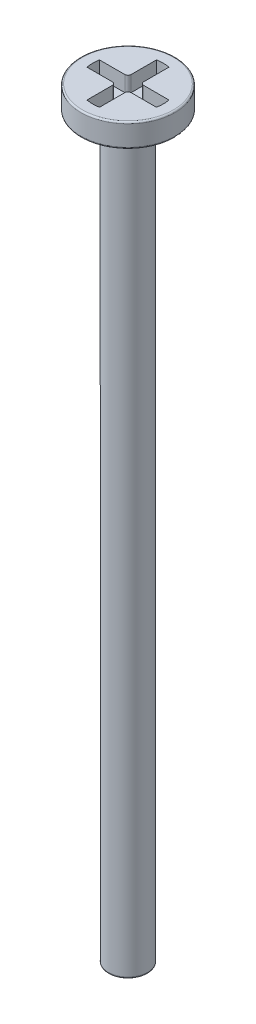
ISO-10303-21;
HEADER;
FILE_DESCRIPTION(('STEP AP214'),'2;1');
FILE_NAME('part.step','',(''),(''),'','','');
FILE_SCHEMA(('AUTOMOTIVE_DESIGN { 1 0 10303 214 1 1 1 1 }'));
ENDSEC;
DATA;
#1=APPLICATION_CONTEXT('core data for automotive mechanical design processes');
#2=APPLICATION_PROTOCOL_DEFINITION('international standard','automotive_design',2000,#1);
#3=PRODUCT_CONTEXT('',#1,'mechanical');
#4=PRODUCT('Part','Part','',(#3));
#5=PRODUCT_RELATED_PRODUCT_CATEGORY('part','',(#4));
#6=PRODUCT_DEFINITION_FORMATION('','',#4);
#7=PRODUCT_DEFINITION_CONTEXT('part definition',#1,'design');
#8=PRODUCT_DEFINITION('design','',#6,#7);
#9=PRODUCT_DEFINITION_SHAPE('','',#8);
#10=(LENGTH_UNIT() NAMED_UNIT(*) SI_UNIT(.MILLI.,.METRE.));
#11=(NAMED_UNIT(*) PLANE_ANGLE_UNIT() SI_UNIT($,.RADIAN.));
#12=(NAMED_UNIT(*) SI_UNIT($,.STERADIAN.) SOLID_ANGLE_UNIT());
#13=UNCERTAINTY_MEASURE_WITH_UNIT(LENGTH_MEASURE(1.E-05),#10,'distance_accuracy_value','');
#14=(GEOMETRIC_REPRESENTATION_CONTEXT(3) GLOBAL_UNCERTAINTY_ASSIGNED_CONTEXT((#13)) GLOBAL_UNIT_ASSIGNED_CONTEXT((#10,
#11,#12)) REPRESENTATION_CONTEXT('',''));
#15=CARTESIAN_POINT('',(0.,0.,0.));
#16=DIRECTION('',(0.,0.,1.));
#17=DIRECTION('',(1.,0.,0.));
#18=AXIS2_PLACEMENT_3D('',#15,#16,#17);
#19=CARTESIAN_POINT('',(0.,0.,0.));
#20=DIRECTION('',(0.,1.,0.));
#21=DIRECTION('',(0.,0.,1.));
#22=AXIS2_PLACEMENT_3D('',#19,#20,#21);
#23=PLANE('',#22);
#24=CARTESIAN_POINT('',(0.,0.,0.));
#25=DIRECTION('',(0.,1.,0.));
#26=DIRECTION('',(0.,0.,1.));
#27=AXIS2_PLACEMENT_3D('',#24,#25,#26);
#28=CIRCLE('',#27,2.25);
#29=CARTESIAN_POINT('',(0.400000000000136,0.,-2.21415898254844));
#30=VERTEX_POINT('',#29);
#31=CARTESIAN_POINT('',(-0.3999999999999,0.,-2.21415898254845));
#32=VERTEX_POINT('',#31);
#33=EDGE_CURVE('E47',#30,#32,#28,.T.);
#34=ORIENTED_EDGE('',*,*,#33,.F.);
#35=DIRECTION('',(0.,0.,-1.));
#36=VECTOR('',#35,1.);
#37=CARTESIAN_POINT('',(0.400000000000136,0.,-2.21415898254844));
#38=LINE('',#37,#36);
#39=CARTESIAN_POINT('',(0.399999999999956,0.,-0.59999999999992));
#40=VERTEX_POINT('',#39);
#41=EDGE_CURVE('E220',#40,#30,#38,.T.);
#42=ORIENTED_EDGE('',*,*,#41,.F.);
#43=CARTESIAN_POINT('',(0.599999999999934,0.,-0.600000000000003));
#44=DIRECTION('',(0.,-1.,0.));
#45=DIRECTION('',(0.,0.,-1.));
#46=AXIS2_PLACEMENT_3D('',#43,#44,#45);
#47=CIRCLE('',#46,0.2);
#48=CARTESIAN_POINT('',(0.600000000000031,0.,-0.39999999999997));
#49=VERTEX_POINT('',#48);
#50=EDGE_CURVE('E218',#49,#40,#47,.T.);
#51=ORIENTED_EDGE('',*,*,#50,.F.);
#52=DIRECTION('',(-1.,0.,0.));
#53=VECTOR('',#52,1.);
#54=CARTESIAN_POINT('',(0.600000000000031,0.,-0.39999999999997));
#55=LINE('',#54,#53);
#56=CARTESIAN_POINT('',(2.21415898254844,0.,-0.400000000000025));
#57=VERTEX_POINT('',#56);
#58=EDGE_CURVE('E155',#57,#49,#55,.T.);
#59=ORIENTED_EDGE('',*,*,#58,.F.);
#60=CARTESIAN_POINT('',(0.,0.,0.));
#61=DIRECTION('',(0.,1.,0.));
#62=DIRECTION('',(0.,0.,1.));
#63=AXIS2_PLACEMENT_3D('',#60,#61,#62);
#64=CIRCLE('',#63,2.25);
#65=CARTESIAN_POINT('',(2.21415898254837,0.,0.39999999999997));
#66=VERTEX_POINT('',#65);
#67=EDGE_CURVE('E214',#66,#57,#64,.T.);
#68=ORIENTED_EDGE('',*,*,#67,.F.);
#69=DIRECTION('',(1.,0.,0.));
#70=VECTOR('',#69,1.);
#71=CARTESIAN_POINT('',(0.599999999999962,0.,0.399999999999998));
#72=LINE('',#71,#70);
#73=CARTESIAN_POINT('',(0.599999999999962,0.,0.399999999999998));
#74=VERTEX_POINT('',#73);
#75=EDGE_CURVE('E211',#74,#66,#72,.T.);
#76=ORIENTED_EDGE('',*,*,#75,.F.);
#77=CARTESIAN_POINT('',(0.599999999999878,0.,0.600000000000073));
#78=DIRECTION('',(0.,-1.,0.));
#79=DIRECTION('',(0.,0.,-1.));
#80=AXIS2_PLACEMENT_3D('',#77,#78,#79);
#81=CIRCLE('',#80,0.2);
#82=CARTESIAN_POINT('',(0.400000000000122,0.,0.600000000000031));
#83=VERTEX_POINT('',#82);
#84=EDGE_CURVE('E208',#83,#74,#81,.T.);
#85=ORIENTED_EDGE('',*,*,#84,.F.);
#86=DIRECTION('',(0.,0.,-1.));
#87=VECTOR('',#86,1.);
#88=CARTESIAN_POINT('',(0.400000000000122,0.,0.600000000000031));
#89=LINE('',#88,#87);
#90=CARTESIAN_POINT('',(0.399999999999956,0.,2.21415898254848));
#91=VERTEX_POINT('',#90);
#92=EDGE_CURVE('E205',#91,#83,#89,.T.);
#93=ORIENTED_EDGE('',*,*,#92,.F.);
#94=CARTESIAN_POINT('',(0.,0.,0.));
#95=DIRECTION('',(0.,1.,0.));
#96=DIRECTION('',(0.,0.,1.));
#97=AXIS2_PLACEMENT_3D('',#94,#95,#96);
#98=CIRCLE('',#97,2.25);
#99=CARTESIAN_POINT('',(-0.400000000000011,0.,2.21415898254848));
#100=VERTEX_POINT('',#99);
#101=EDGE_CURVE('E202',#100,#91,#98,.T.);
#102=ORIENTED_EDGE('',*,*,#101,.F.);
#103=DIRECTION('',(0.,0.,1.));
#104=VECTOR('',#103,1.);
#105=CARTESIAN_POINT('',(-0.399999999999887,0.,0.600000000000087));
#106=LINE('',#105,#104);
#107=CARTESIAN_POINT('',(-0.399999999999887,0.,0.600000000000087));
#108=VERTEX_POINT('',#107);
#109=EDGE_CURVE('E199',#108,#100,#106,.T.);
#110=ORIENTED_EDGE('',*,*,#109,.F.);
#111=CARTESIAN_POINT('',(-0.59999999999992,0.,0.600000000000031));
#112=DIRECTION('',(0.,-1.,0.));
#113=DIRECTION('',(0.,0.,-1.));
#114=AXIS2_PLACEMENT_3D('',#111,#112,#113);
#115=CIRCLE('',#114,0.2);
#116=CARTESIAN_POINT('',(-0.6000000000001,0.,0.399999999999984));
#117=VERTEX_POINT('',#116);
#118=EDGE_CURVE('E196',#117,#108,#115,.T.);
#119=ORIENTED_EDGE('',*,*,#118,.F.);
#120=DIRECTION('',(1.,0.,0.));
#121=VECTOR('',#120,1.);
#122=CARTESIAN_POINT('',(-2.21415898254856,0.,0.400000000000039));
#123=LINE('',#122,#121);
#124=CARTESIAN_POINT('',(-2.21415898254856,0.,0.400000000000039));
#125=VERTEX_POINT('',#124);
#126=EDGE_CURVE('E193',#125,#117,#123,.T.);
#127=ORIENTED_EDGE('',*,*,#126,.F.);
#128=CARTESIAN_POINT('',(0.,0.,0.));
#129=DIRECTION('',(0.,1.,0.));
#130=DIRECTION('',(0.,0.,1.));
#131=AXIS2_PLACEMENT_3D('',#128,#129,#130);
#132=CIRCLE('',#131,2.25);
#133=CARTESIAN_POINT('',(-2.21415898254836,0.,-0.399999999999956));
#134=VERTEX_POINT('',#133);
#135=EDGE_CURVE('E190',#134,#125,#132,.T.);
#136=ORIENTED_EDGE('',*,*,#135,.F.);
#137=DIRECTION('',(-1.,0.,0.));
#138=VECTOR('',#137,1.);
#139=CARTESIAN_POINT('',(-2.21415898254836,0.,-0.399999999999956));
#140=LINE('',#139,#138);
#141=CARTESIAN_POINT('',(-0.599999999999989,0.,-0.400000000000011));
#142=VERTEX_POINT('',#141);
#143=EDGE_CURVE('E187',#142,#134,#140,.T.);
#144=ORIENTED_EDGE('',*,*,#143,.F.);
#145=CARTESIAN_POINT('',(-0.599999999999976,0.,-0.599999999999976));
#146=DIRECTION('',(0.,-1.,0.));
#147=DIRECTION('',(0.,0.,-1.));
#148=AXIS2_PLACEMENT_3D('',#145,#146,#147);
#149=CIRCLE('',#148,0.2);
#150=CARTESIAN_POINT('',(-0.400000000000095,0.,-0.599999999999892));
#151=VERTEX_POINT('',#150);
#152=EDGE_CURVE('E184',#151,#142,#149,.T.);
#153=ORIENTED_EDGE('',*,*,#152,.F.);
#154=DIRECTION('',(0.,0.,1.));
#155=VECTOR('',#154,1.);
#156=CARTESIAN_POINT('',(-0.3999999999999,0.,-2.21415898254845));
#157=LINE('',#156,#155);
#158=EDGE_CURVE('E181',#32,#151,#157,.T.);
#159=ORIENTED_EDGE('',*,*,#158,.F.);
#160=EDGE_LOOP('',(#34,#42,#51,#59,#68,#76,#85,#93,#102,#110,#119,#127,#136,#144,#153,#159));
#161=FACE_BOUND('',#160,.T.);
#162=CARTESIAN_POINT('',(0.,0.,0.));
#163=DIRECTION('',(0.,1.,0.));
#164=DIRECTION('',(0.,0.,1.));
#165=AXIS2_PLACEMENT_3D('',#162,#163,#164);
#166=CIRCLE('',#165,2.9);
#167=CARTESIAN_POINT('',(0.,0.,2.9));
#168=VERTEX_POINT('',#167);
#169=EDGE_CURVE('E258',#168,#168,#166,.T.);
#170=ORIENTED_EDGE('',*,*,#169,.T.);
#171=EDGE_LOOP('',(#170));
#172=FACE_BOUND('',#171,.T.);
#173=ADVANCED_FACE('F32',(#161,#172),#23,.T.);
#174=CARTESIAN_POINT('',(0.,14.9128552678076,0.));
#175=DIRECTION('',(0.,1.,0.));
#176=DIRECTION('',(0.,0.,1.));
#177=AXIS2_PLACEMENT_3D('',#174,#175,#176);
#178=CYLINDRICAL_SURFACE('',#177,3.);
#179=CARTESIAN_POINT('',(0.,-0.100000000000003,0.));
#180=DIRECTION('',(0.,1.,0.));
#181=DIRECTION('',(0.,0.,1.));
#182=AXIS2_PLACEMENT_3D('',#179,#180,#181);
#183=CIRCLE('',#182,3.);
#184=CARTESIAN_POINT('',(0.,-0.100000000000003,3.));
#185=VERTEX_POINT('',#184);
#186=EDGE_CURVE('E40',#185,#185,#183,.F.);
#187=ORIENTED_EDGE('',*,*,#186,.T.);
#188=EDGE_LOOP('',(#187));
#189=FACE_BOUND('',#188,.T.);
#190=CARTESIAN_POINT('',(0.,-1.4,0.));
#191=DIRECTION('',(0.,-1.,0.));
#192=DIRECTION('',(0.,0.,-1.));
#193=AXIS2_PLACEMENT_3D('',#190,#191,#192);
#194=CIRCLE('',#193,3.);
#195=CARTESIAN_POINT('',(0.,-1.4,-3.));
#196=VERTEX_POINT('',#195);
#197=EDGE_CURVE('E261',#196,#196,#194,.F.);
#198=ORIENTED_EDGE('',*,*,#197,.T.);
#199=EDGE_LOOP('',(#198));
#200=FACE_BOUND('',#199,.T.);
#201=ADVANCED_FACE('F266',(#189,#200),#178,.T.);
#202=CARTESIAN_POINT('',(-3.00000000000009,-1.50000000000003,0.));
#203=DIRECTION('',(0.,-1.,0.));
#204=DIRECTION('',(0.,0.,-1.));
#205=AXIS2_PLACEMENT_3D('',#202,#203,#204);
#206=PLANE('',#205);
#207=CARTESIAN_POINT('',(0.,-1.5,0.));
#208=DIRECTION('',(0.,-1.,0.));
#209=DIRECTION('',(0.,0.,-1.));
#210=AXIS2_PLACEMENT_3D('',#207,#208,#209);
#211=CIRCLE('',#210,2.9);
#212=CARTESIAN_POINT('',(0.,-1.5,-2.9));
#213=VERTEX_POINT('',#212);
#214=EDGE_CURVE('E11',#213,#213,#211,.T.);
#215=ORIENTED_EDGE('',*,*,#214,.T.);
#216=EDGE_LOOP('',(#215));
#217=FACE_BOUND('',#216,.T.);
#218=CARTESIAN_POINT('',(0.,-1.5,0.));
#219=DIRECTION('',(0.,1.,0.));
#220=DIRECTION('',(0.,0.,1.));
#221=AXIS2_PLACEMENT_3D('',#218,#219,#220);
#222=CIRCLE('',#221,1.25);
#223=CARTESIAN_POINT('',(0.,-1.5,1.25));
#224=VERTEX_POINT('',#223);
#225=EDGE_CURVE('E224',#224,#224,#222,.T.);
#226=ORIENTED_EDGE('',*,*,#225,.T.);
#227=EDGE_LOOP('',(#226));
#228=FACE_BOUND('',#227,.T.);
#229=ADVANCED_FACE('F281',(#217,#228),#206,.T.);
#230=CARTESIAN_POINT('',(0.,14.9128552678076,0.));
#231=DIRECTION('',(0.,1.,0.));
#232=DIRECTION('',(0.,0.,1.));
#233=AXIS2_PLACEMENT_3D('',#230,#231,#232);
#234=CYLINDRICAL_SURFACE('',#233,1.25);
#235=CARTESIAN_POINT('',(0.,-48.4000000000002,-1.2490009027033E-13));
#236=DIRECTION('',(0.,-1.,0.));
#237=DIRECTION('',(0.,0.,-1.));
#238=AXIS2_PLACEMENT_3D('',#235,#236,#237);
#239=CIRCLE('',#238,1.25);
#240=CARTESIAN_POINT('',(0.,-48.4000000000002,-1.25000000000012));
#241=VERTEX_POINT('',#240);
#242=EDGE_CURVE('E252',#241,#241,#239,.F.);
#243=ORIENTED_EDGE('',*,*,#242,.T.);
#244=EDGE_LOOP('',(#243));
#245=FACE_BOUND('',#244,.T.);
#246=ORIENTED_EDGE('',*,*,#225,.F.);
#247=EDGE_LOOP('',(#246));
#248=FACE_BOUND('',#247,.T.);
#249=ADVANCED_FACE('F291',(#245,#248),#234,.T.);
#250=CARTESIAN_POINT('',(-1.24999999999999,-48.5000000000002,0.));
#251=DIRECTION('',(0.,-1.,0.));
#252=DIRECTION('',(0.,0.,-1.));
#253=AXIS2_PLACEMENT_3D('',#250,#251,#252);
#254=PLANE('',#253);
#255=CARTESIAN_POINT('',(0.,-48.5000000000002,-1.2490009027033E-13));
#256=DIRECTION('',(0.,-1.,0.));
#257=DIRECTION('',(0.,0.,-1.));
#258=AXIS2_PLACEMENT_3D('',#255,#256,#257);
#259=CIRCLE('',#258,1.15);
#260=CARTESIAN_POINT('',(0.,-48.5000000000002,-1.15000000000012));
#261=VERTEX_POINT('',#260);
#262=EDGE_CURVE('E255',#261,#261,#259,.T.);
#263=ORIENTED_EDGE('',*,*,#262,.T.);
#264=EDGE_LOOP('',(#263));
#265=FACE_BOUND('',#264,.T.);
#266=ADVANCED_FACE('F286',(#265),#254,.T.);
#267=CARTESIAN_POINT('',(0.,-48.4000000000002,-1.2490009027033E-13));
#268=DIRECTION('',(0.,-1.,0.));
#269=DIRECTION('',(0.,0.,-1.));
#270=AXIS2_PLACEMENT_3D('',#267,#268,#269);
#271=TOROIDAL_SURFACE('',#270,1.15,0.1);
#272=ORIENTED_EDGE('',*,*,#262,.F.);
#273=EDGE_LOOP('',(#272));
#274=FACE_BOUND('',#273,.T.);
#275=ORIENTED_EDGE('',*,*,#242,.F.);
#276=EDGE_LOOP('',(#275));
#277=FACE_BOUND('',#276,.T.);
#278=ADVANCED_FACE('F272',(#274,#277),#271,.T.);
#279=CARTESIAN_POINT('',(0.,-0.100000000000003,0.));
#280=DIRECTION('',(0.,1.,0.));
#281=DIRECTION('',(0.,0.,1.));
#282=AXIS2_PLACEMENT_3D('',#279,#280,#281);
#283=TOROIDAL_SURFACE('',#282,2.9,0.1);
#284=ORIENTED_EDGE('',*,*,#186,.F.);
#285=EDGE_LOOP('',(#284));
#286=FACE_BOUND('',#285,.T.);
#287=ORIENTED_EDGE('',*,*,#169,.F.);
#288=EDGE_LOOP('',(#287));
#289=FACE_BOUND('',#288,.T.);
#290=ADVANCED_FACE('F269',(#286,#289),#283,.T.);
#291=CARTESIAN_POINT('',(0.,-1.4,0.));
#292=DIRECTION('',(0.,-1.,0.));
#293=DIRECTION('',(0.,0.,-1.));
#294=AXIS2_PLACEMENT_3D('',#291,#292,#293);
#295=TOROIDAL_SURFACE('',#294,2.9,0.1);
#296=ORIENTED_EDGE('',*,*,#214,.F.);
#297=EDGE_LOOP('',(#296));
#298=FACE_BOUND('',#297,.T.);
#299=ORIENTED_EDGE('',*,*,#197,.F.);
#300=EDGE_LOOP('',(#299));
#301=FACE_BOUND('',#300,.T.);
#302=ADVANCED_FACE('F34',(#298,#301),#295,.T.);
#303=CARTESIAN_POINT('',(0.,-1.,0.));
#304=DIRECTION('',(0.,1.,0.));
#305=DIRECTION('',(0.,0.,1.));
#306=AXIS2_PLACEMENT_3D('',#303,#304,#305);
#307=CYLINDRICAL_SURFACE('',#306,2.25);
#308=ORIENTED_EDGE('',*,*,#33,.T.);
#309=DIRECTION('',(0.,1.,0.));
#310=VECTOR('',#309,1.);
#311=CARTESIAN_POINT('',(-0.3999999999999,-1.,-2.21415898254845));
#312=LINE('',#311,#310);
#313=CARTESIAN_POINT('',(-0.3999999999999,-1.,-2.21415898254845));
#314=VERTEX_POINT('',#313);
#315=EDGE_CURVE('E107',#314,#32,#312,.T.);
#316=ORIENTED_EDGE('',*,*,#315,.F.);
#317=CARTESIAN_POINT('',(0.,-1.,0.));
#318=DIRECTION('',(0.,1.,0.));
#319=DIRECTION('',(0.,0.,1.));
#320=AXIS2_PLACEMENT_3D('',#317,#318,#319);
#321=CIRCLE('',#320,2.25);
#322=CARTESIAN_POINT('',(0.400000000000136,-1.,-2.21415898254844));
#323=VERTEX_POINT('',#322);
#324=EDGE_CURVE('E222',#323,#314,#321,.T.);
#325=ORIENTED_EDGE('',*,*,#324,.F.);
#326=DIRECTION('',(0.,1.,0.));
#327=VECTOR('',#326,1.);
#328=CARTESIAN_POINT('',(0.400000000000136,-1.,-2.21415898254844));
#329=LINE('',#328,#327);
#330=EDGE_CURVE('E55',#323,#30,#329,.T.);
#331=ORIENTED_EDGE('',*,*,#330,.T.);
#332=EDGE_LOOP('',(#308,#316,#325,#331));
#333=FACE_BOUND('',#332,.T.);
#334=ADVANCED_FACE('F308',(#333),#307,.F.);
#335=CARTESIAN_POINT('',(0.400000000000136,-1.,-2.21415898254844));
#336=DIRECTION('',(1.,0.,0.));
#337=DIRECTION('',(0.,0.,-1.));
#338=AXIS2_PLACEMENT_3D('',#335,#336,#337);
#339=PLANE('',#338);
#340=ORIENTED_EDGE('',*,*,#41,.T.);
#341=ORIENTED_EDGE('',*,*,#330,.F.);
#342=DIRECTION('',(0.,0.,-1.));
#343=VECTOR('',#342,1.);
#344=CARTESIAN_POINT('',(0.400000000000136,-1.,-2.21415898254844));
#345=LINE('',#344,#343);
#346=CARTESIAN_POINT('',(0.399999999999956,-1.,-0.59999999999992));
#347=VERTEX_POINT('',#346);
#348=EDGE_CURVE('E167',#347,#323,#345,.T.);
#349=ORIENTED_EDGE('',*,*,#348,.F.);
#350=DIRECTION('',(0.,1.,0.));
#351=VECTOR('',#350,1.);
#352=CARTESIAN_POINT('',(0.399999999999956,-1.,-0.59999999999992));
#353=LINE('',#352,#351);
#354=EDGE_CURVE('E159',#347,#40,#353,.T.);
#355=ORIENTED_EDGE('',*,*,#354,.T.);
#356=EDGE_LOOP('',(#340,#341,#349,#355));
#357=FACE_BOUND('',#356,.T.);
#358=ADVANCED_FACE('F311',(#357),#339,.F.);
#359=CARTESIAN_POINT('',(0.599999999999934,-1.,-0.600000000000003));
#360=DIRECTION('',(0.,1.,0.));
#361=DIRECTION('',(0.,0.,1.));
#362=AXIS2_PLACEMENT_3D('',#359,#360,#361);
#363=CYLINDRICAL_SURFACE('',#362,0.2);
#364=ORIENTED_EDGE('',*,*,#50,.T.);
#365=ORIENTED_EDGE('',*,*,#354,.F.);
#366=CARTESIAN_POINT('',(0.599999999999934,-1.,-0.600000000000003));
#367=DIRECTION('',(0.,-1.,0.));
#368=DIRECTION('',(0.,0.,-1.));
#369=AXIS2_PLACEMENT_3D('',#366,#367,#368);
#370=CIRCLE('',#369,0.2);
#371=CARTESIAN_POINT('',(0.600000000000031,-1.,-0.39999999999997));
#372=VERTEX_POINT('',#371);
#373=EDGE_CURVE('E163',#372,#347,#370,.T.);
#374=ORIENTED_EDGE('',*,*,#373,.F.);
#375=DIRECTION('',(0.,1.,0.));
#376=VECTOR('',#375,1.);
#377=CARTESIAN_POINT('',(0.600000000000031,-1.,-0.39999999999997));
#378=LINE('',#377,#376);
#379=EDGE_CURVE('E148',#372,#49,#378,.T.);
#380=ORIENTED_EDGE('',*,*,#379,.T.);
#381=EDGE_LOOP('',(#364,#365,#374,#380));
#382=FACE_BOUND('',#381,.T.);
#383=ADVANCED_FACE('F164',(#382),#363,.T.);
#384=CARTESIAN_POINT('',(0.600000000000031,-1.,-0.39999999999997));
#385=DIRECTION('',(0.,0.,-1.));
#386=DIRECTION('',(-1.,0.,0.));
#387=AXIS2_PLACEMENT_3D('',#384,#385,#386);
#388=PLANE('',#387);
#389=ORIENTED_EDGE('',*,*,#58,.T.);
#390=ORIENTED_EDGE('',*,*,#379,.F.);
#391=DIRECTION('',(-1.,0.,0.));
#392=VECTOR('',#391,1.);
#393=CARTESIAN_POINT('',(0.600000000000031,-1.,-0.39999999999997));
#394=LINE('',#393,#392);
#395=CARTESIAN_POINT('',(2.21415898254844,-1.,-0.400000000000025));
#396=VERTEX_POINT('',#395);
#397=EDGE_CURVE('E152',#396,#372,#394,.T.);
#398=ORIENTED_EDGE('',*,*,#397,.F.);
#399=DIRECTION('',(0.,1.,0.));
#400=VECTOR('',#399,1.);
#401=CARTESIAN_POINT('',(2.21415898254844,-1.,-0.400000000000025));
#402=LINE('',#401,#400);
#403=EDGE_CURVE('E160',#396,#57,#402,.T.);
#404=ORIENTED_EDGE('',*,*,#403,.T.);
#405=EDGE_LOOP('',(#389,#390,#398,#404));
#406=FACE_BOUND('',#405,.T.);
#407=ADVANCED_FACE('F150',(#406),#388,.F.);
#408=CARTESIAN_POINT('',(0.,-1.,0.));
#409=DIRECTION('',(0.,1.,0.));
#410=DIRECTION('',(0.,0.,1.));
#411=AXIS2_PLACEMENT_3D('',#408,#409,#410);
#412=CYLINDRICAL_SURFACE('',#411,2.25);
#413=ORIENTED_EDGE('',*,*,#67,.T.);
#414=ORIENTED_EDGE('',*,*,#403,.F.);
#415=CARTESIAN_POINT('',(0.,-1.,0.));
#416=DIRECTION('',(0.,1.,0.));
#417=DIRECTION('',(0.,0.,1.));
#418=AXIS2_PLACEMENT_3D('',#415,#416,#417);
#419=CIRCLE('',#418,2.25);
#420=CARTESIAN_POINT('',(2.21415898254837,-1.,0.39999999999997));
#421=VERTEX_POINT('',#420);
#422=EDGE_CURVE('E173',#421,#396,#419,.T.);
#423=ORIENTED_EDGE('',*,*,#422,.F.);
#424=DIRECTION('',(0.,1.,0.));
#425=VECTOR('',#424,1.);
#426=CARTESIAN_POINT('',(2.21415898254837,-1.,0.39999999999997));
#427=LINE('',#426,#425);
#428=EDGE_CURVE('E227',#421,#66,#427,.T.);
#429=ORIENTED_EDGE('',*,*,#428,.T.);
#430=EDGE_LOOP('',(#413,#414,#423,#429));
#431=FACE_BOUND('',#430,.T.);
#432=ADVANCED_FACE('F355',(#431),#412,.F.);
#433=CARTESIAN_POINT('',(0.599999999999962,-1.,0.399999999999998));
#434=DIRECTION('',(0.,0.,1.));
#435=DIRECTION('',(1.,0.,0.));
#436=AXIS2_PLACEMENT_3D('',#433,#434,#435);
#437=PLANE('',#436);
#438=ORIENTED_EDGE('',*,*,#75,.T.);
#439=ORIENTED_EDGE('',*,*,#428,.F.);
#440=DIRECTION('',(1.,0.,0.));
#441=VECTOR('',#440,1.);
#442=CARTESIAN_POINT('',(0.599999999999962,-1.,0.399999999999998));
#443=LINE('',#442,#441);
#444=CARTESIAN_POINT('',(0.599999999999962,-1.,0.399999999999998));
#445=VERTEX_POINT('',#444);
#446=EDGE_CURVE('E175',#445,#421,#443,.T.);
#447=ORIENTED_EDGE('',*,*,#446,.F.);
#448=DIRECTION('',(0.,1.,0.));
#449=VECTOR('',#448,1.);
#450=CARTESIAN_POINT('',(0.599999999999962,-1.,0.399999999999998));
#451=LINE('',#450,#449);
#452=EDGE_CURVE('E229',#445,#74,#451,.T.);
#453=ORIENTED_EDGE('',*,*,#452,.T.);
#454=EDGE_LOOP('',(#438,#439,#447,#453));
#455=FACE_BOUND('',#454,.T.);
#456=ADVANCED_FACE('F351',(#455),#437,.F.);
#457=CARTESIAN_POINT('',(0.599999999999878,-1.,0.600000000000073));
#458=DIRECTION('',(0.,1.,0.));
#459=DIRECTION('',(0.,0.,1.));
#460=AXIS2_PLACEMENT_3D('',#457,#458,#459);
#461=CYLINDRICAL_SURFACE('',#460,0.2);
#462=ORIENTED_EDGE('',*,*,#84,.T.);
#463=ORIENTED_EDGE('',*,*,#452,.F.);
#464=CARTESIAN_POINT('',(0.599999999999878,-1.,0.600000000000073));
#465=DIRECTION('',(0.,-1.,0.));
#466=DIRECTION('',(0.,0.,-1.));
#467=AXIS2_PLACEMENT_3D('',#464,#465,#466);
#468=CIRCLE('',#467,0.2);
#469=CARTESIAN_POINT('',(0.400000000000122,-1.,0.600000000000031));
#470=VERTEX_POINT('',#469);
#471=EDGE_CURVE('E550',#470,#445,#468,.T.);
#472=ORIENTED_EDGE('',*,*,#471,.F.);
#473=DIRECTION('',(0.,1.,0.));
#474=VECTOR('',#473,1.);
#475=CARTESIAN_POINT('',(0.400000000000122,-1.,0.600000000000031));
#476=LINE('',#475,#474);
#477=EDGE_CURVE('E231',#470,#83,#476,.T.);
#478=ORIENTED_EDGE('',*,*,#477,.T.);
#479=EDGE_LOOP('',(#462,#463,#472,#478));
#480=FACE_BOUND('',#479,.T.);
#481=ADVANCED_FACE('F347',(#480),#461,.T.);
#482=CARTESIAN_POINT('',(0.400000000000122,-1.,0.600000000000031));
#483=DIRECTION('',(1.,0.,0.));
#484=DIRECTION('',(0.,0.,-1.));
#485=AXIS2_PLACEMENT_3D('',#482,#483,#484);
#486=PLANE('',#485);
#487=ORIENTED_EDGE('',*,*,#92,.T.);
#488=ORIENTED_EDGE('',*,*,#477,.F.);
#489=DIRECTION('',(0.,0.,-1.));
#490=VECTOR('',#489,1.);
#491=CARTESIAN_POINT('',(0.400000000000122,-1.,0.600000000000031));
#492=LINE('',#491,#490);
#493=CARTESIAN_POINT('',(0.399999999999956,-1.,2.21415898254848));
#494=VERTEX_POINT('',#493);
#495=EDGE_CURVE('E547',#494,#470,#492,.T.);
#496=ORIENTED_EDGE('',*,*,#495,.F.);
#497=DIRECTION('',(0.,1.,0.));
#498=VECTOR('',#497,1.);
#499=CARTESIAN_POINT('',(0.399999999999956,-1.,2.21415898254848));
#500=LINE('',#499,#498);
#501=EDGE_CURVE('E233',#494,#91,#500,.T.);
#502=ORIENTED_EDGE('',*,*,#501,.T.);
#503=EDGE_LOOP('',(#487,#488,#496,#502));
#504=FACE_BOUND('',#503,.T.);
#505=ADVANCED_FACE('F343',(#504),#486,.F.);
#506=CARTESIAN_POINT('',(0.,-1.,0.));
#507=DIRECTION('',(0.,1.,0.));
#508=DIRECTION('',(0.,0.,1.));
#509=AXIS2_PLACEMENT_3D('',#506,#507,#508);
#510=CYLINDRICAL_SURFACE('',#509,2.25);
#511=ORIENTED_EDGE('',*,*,#101,.T.);
#512=ORIENTED_EDGE('',*,*,#501,.F.);
#513=CARTESIAN_POINT('',(0.,-1.,0.));
#514=DIRECTION('',(0.,1.,0.));
#515=DIRECTION('',(0.,0.,1.));
#516=AXIS2_PLACEMENT_3D('',#513,#514,#515);
#517=CIRCLE('',#516,2.25);
#518=CARTESIAN_POINT('',(-0.400000000000011,-1.,2.21415898254848));
#519=VERTEX_POINT('',#518);
#520=EDGE_CURVE('E544',#519,#494,#517,.T.);
#521=ORIENTED_EDGE('',*,*,#520,.F.);
#522=DIRECTION('',(0.,1.,0.));
#523=VECTOR('',#522,1.);
#524=CARTESIAN_POINT('',(-0.400000000000011,-1.,2.21415898254848));
#525=LINE('',#524,#523);
#526=EDGE_CURVE('E235',#519,#100,#525,.T.);
#527=ORIENTED_EDGE('',*,*,#526,.T.);
#528=EDGE_LOOP('',(#511,#512,#521,#527));
#529=FACE_BOUND('',#528,.T.);
#530=ADVANCED_FACE('F339',(#529),#510,.F.);
#531=CARTESIAN_POINT('',(-0.399999999999887,-1.,0.600000000000087));
#532=DIRECTION('',(-1.,0.,0.));
#533=DIRECTION('',(0.,0.,1.));
#534=AXIS2_PLACEMENT_3D('',#531,#532,#533);
#535=PLANE('',#534);
#536=ORIENTED_EDGE('',*,*,#109,.T.);
#537=ORIENTED_EDGE('',*,*,#526,.F.);
#538=DIRECTION('',(0.,0.,1.));
#539=VECTOR('',#538,1.);
#540=CARTESIAN_POINT('',(-0.399999999999887,-1.,0.600000000000087));
#541=LINE('',#540,#539);
#542=CARTESIAN_POINT('',(-0.399999999999887,-1.,0.600000000000087));
#543=VERTEX_POINT('',#542);
#544=EDGE_CURVE('E541',#543,#519,#541,.T.);
#545=ORIENTED_EDGE('',*,*,#544,.F.);
#546=DIRECTION('',(0.,1.,0.));
#547=VECTOR('',#546,1.);
#548=CARTESIAN_POINT('',(-0.399999999999887,-1.,0.600000000000087));
#549=LINE('',#548,#547);
#550=EDGE_CURVE('E237',#543,#108,#549,.T.);
#551=ORIENTED_EDGE('',*,*,#550,.T.);
#552=EDGE_LOOP('',(#536,#537,#545,#551));
#553=FACE_BOUND('',#552,.T.);
#554=ADVANCED_FACE('F335',(#553),#535,.F.);
#555=CARTESIAN_POINT('',(-0.59999999999992,-1.,0.600000000000031));
#556=DIRECTION('',(0.,1.,0.));
#557=DIRECTION('',(0.,0.,1.));
#558=AXIS2_PLACEMENT_3D('',#555,#556,#557);
#559=CYLINDRICAL_SURFACE('',#558,0.2);
#560=ORIENTED_EDGE('',*,*,#118,.T.);
#561=ORIENTED_EDGE('',*,*,#550,.F.);
#562=CARTESIAN_POINT('',(-0.59999999999992,-1.,0.600000000000031));
#563=DIRECTION('',(0.,-1.,0.));
#564=DIRECTION('',(0.,0.,-1.));
#565=AXIS2_PLACEMENT_3D('',#562,#563,#564);
#566=CIRCLE('',#565,0.2);
#567=CARTESIAN_POINT('',(-0.6000000000001,-1.,0.399999999999984));
#568=VERTEX_POINT('',#567);
#569=EDGE_CURVE('E538',#568,#543,#566,.T.);
#570=ORIENTED_EDGE('',*,*,#569,.F.);
#571=DIRECTION('',(0.,1.,0.));
#572=VECTOR('',#571,1.);
#573=CARTESIAN_POINT('',(-0.6000000000001,-1.,0.399999999999984));
#574=LINE('',#573,#572);
#575=EDGE_CURVE('E239',#568,#117,#574,.T.);
#576=ORIENTED_EDGE('',*,*,#575,.T.);
#577=EDGE_LOOP('',(#560,#561,#570,#576));
#578=FACE_BOUND('',#577,.T.);
#579=ADVANCED_FACE('F331',(#578),#559,.T.);
#580=CARTESIAN_POINT('',(-2.21415898254856,-1.,0.400000000000039));
#581=DIRECTION('',(0.,0.,1.));
#582=DIRECTION('',(1.,0.,0.));
#583=AXIS2_PLACEMENT_3D('',#580,#581,#582);
#584=PLANE('',#583);
#585=ORIENTED_EDGE('',*,*,#126,.T.);
#586=ORIENTED_EDGE('',*,*,#575,.F.);
#587=DIRECTION('',(1.,0.,0.));
#588=VECTOR('',#587,1.);
#589=CARTESIAN_POINT('',(-2.21415898254856,-1.,0.400000000000039));
#590=LINE('',#589,#588);
#591=CARTESIAN_POINT('',(-2.21415898254856,-1.,0.400000000000039));
#592=VERTEX_POINT('',#591);
#593=EDGE_CURVE('E535',#592,#568,#590,.T.);
#594=ORIENTED_EDGE('',*,*,#593,.F.);
#595=DIRECTION('',(0.,1.,0.));
#596=VECTOR('',#595,1.);
#597=CARTESIAN_POINT('',(-2.21415898254856,-1.,0.400000000000039));
#598=LINE('',#597,#596);
#599=EDGE_CURVE('E241',#592,#125,#598,.T.);
#600=ORIENTED_EDGE('',*,*,#599,.T.);
#601=EDGE_LOOP('',(#585,#586,#594,#600));
#602=FACE_BOUND('',#601,.T.);
#603=ADVANCED_FACE('F327',(#602),#584,.F.);
#604=CARTESIAN_POINT('',(0.,-1.,0.));
#605=DIRECTION('',(0.,1.,0.));
#606=DIRECTION('',(0.,0.,1.));
#607=AXIS2_PLACEMENT_3D('',#604,#605,#606);
#608=CYLINDRICAL_SURFACE('',#607,2.25);
#609=ORIENTED_EDGE('',*,*,#135,.T.);
#610=ORIENTED_EDGE('',*,*,#599,.F.);
#611=CARTESIAN_POINT('',(0.,-1.,0.));
#612=DIRECTION('',(0.,1.,0.));
#613=DIRECTION('',(0.,0.,1.));
#614=AXIS2_PLACEMENT_3D('',#611,#612,#613);
#615=CIRCLE('',#614,2.25);
#616=CARTESIAN_POINT('',(-2.21415898254836,-1.,-0.399999999999956));
#617=VERTEX_POINT('',#616);
#618=EDGE_CURVE('E532',#617,#592,#615,.T.);
#619=ORIENTED_EDGE('',*,*,#618,.F.);
#620=DIRECTION('',(0.,1.,0.));
#621=VECTOR('',#620,1.);
#622=CARTESIAN_POINT('',(-2.21415898254836,-1.,-0.399999999999956));
#623=LINE('',#622,#621);
#624=EDGE_CURVE('E243',#617,#134,#623,.T.);
#625=ORIENTED_EDGE('',*,*,#624,.T.);
#626=EDGE_LOOP('',(#609,#610,#619,#625));
#627=FACE_BOUND('',#626,.T.);
#628=ADVANCED_FACE('F323',(#627),#608,.F.);
#629=CARTESIAN_POINT('',(-2.21415898254836,-1.,-0.399999999999956));
#630=DIRECTION('',(0.,0.,-1.));
#631=DIRECTION('',(-1.,0.,0.));
#632=AXIS2_PLACEMENT_3D('',#629,#630,#631);
#633=PLANE('',#632);
#634=ORIENTED_EDGE('',*,*,#143,.T.);
#635=ORIENTED_EDGE('',*,*,#624,.F.);
#636=DIRECTION('',(-1.,0.,0.));
#637=VECTOR('',#636,1.);
#638=CARTESIAN_POINT('',(-2.21415898254836,-1.,-0.399999999999956));
#639=LINE('',#638,#637);
#640=CARTESIAN_POINT('',(-0.599999999999989,-1.,-0.400000000000011));
#641=VERTEX_POINT('',#640);
#642=EDGE_CURVE('E529',#641,#617,#639,.T.);
#643=ORIENTED_EDGE('',*,*,#642,.F.);
#644=DIRECTION('',(0.,1.,0.));
#645=VECTOR('',#644,1.);
#646=CARTESIAN_POINT('',(-0.599999999999989,-1.,-0.400000000000011));
#647=LINE('',#646,#645);
#648=EDGE_CURVE('E245',#641,#142,#647,.T.);
#649=ORIENTED_EDGE('',*,*,#648,.T.);
#650=EDGE_LOOP('',(#634,#635,#643,#649));
#651=FACE_BOUND('',#650,.T.);
#652=ADVANCED_FACE('F319',(#651),#633,.F.);
#653=CARTESIAN_POINT('',(-0.599999999999976,-1.,-0.599999999999976));
#654=DIRECTION('',(0.,1.,0.));
#655=DIRECTION('',(0.,0.,1.));
#656=AXIS2_PLACEMENT_3D('',#653,#654,#655);
#657=CYLINDRICAL_SURFACE('',#656,0.2);
#658=ORIENTED_EDGE('',*,*,#152,.T.);
#659=ORIENTED_EDGE('',*,*,#648,.F.);
#660=CARTESIAN_POINT('',(-0.599999999999976,-1.,-0.599999999999976));
#661=DIRECTION('',(0.,-1.,0.));
#662=DIRECTION('',(0.,0.,-1.));
#663=AXIS2_PLACEMENT_3D('',#660,#661,#662);
#664=CIRCLE('',#663,0.2);
#665=CARTESIAN_POINT('',(-0.400000000000095,-1.,-0.599999999999892));
#666=VERTEX_POINT('',#665);
#667=EDGE_CURVE('E524',#666,#641,#664,.T.);
#668=ORIENTED_EDGE('',*,*,#667,.F.);
#669=DIRECTION('',(0.,1.,0.));
#670=VECTOR('',#669,1.);
#671=CARTESIAN_POINT('',(-0.400000000000095,-1.,-0.599999999999892));
#672=LINE('',#671,#670);
#673=EDGE_CURVE('E247',#666,#151,#672,.T.);
#674=ORIENTED_EDGE('',*,*,#673,.T.);
#675=EDGE_LOOP('',(#658,#659,#668,#674));
#676=FACE_BOUND('',#675,.T.);
#677=ADVANCED_FACE('F315',(#676),#657,.T.);
#678=CARTESIAN_POINT('',(-0.3999999999999,-1.,-2.21415898254845));
#679=DIRECTION('',(-1.,0.,0.));
#680=DIRECTION('',(0.,0.,1.));
#681=AXIS2_PLACEMENT_3D('',#678,#679,#680);
#682=PLANE('',#681);
#683=ORIENTED_EDGE('',*,*,#158,.T.);
#684=ORIENTED_EDGE('',*,*,#673,.F.);
#685=DIRECTION('',(0.,0.,1.));
#686=VECTOR('',#685,1.);
#687=CARTESIAN_POINT('',(-0.3999999999999,-1.,-2.21415898254845));
#688=LINE('',#687,#686);
#689=EDGE_CURVE('E522',#314,#666,#688,.T.);
#690=ORIENTED_EDGE('',*,*,#689,.F.);
#691=ORIENTED_EDGE('',*,*,#315,.T.);
#692=EDGE_LOOP('',(#683,#684,#690,#691));
#693=FACE_BOUND('',#692,.T.);
#694=ADVANCED_FACE('F312',(#693),#682,.F.);
#695=CARTESIAN_POINT('',(0.,-1.,0.));
#696=DIRECTION('',(0.,1.,0.));
#697=DIRECTION('',(0.,0.,1.));
#698=AXIS2_PLACEMENT_3D('',#695,#696,#697);
#699=PLANE('',#698);
#700=ORIENTED_EDGE('',*,*,#324,.T.);
#701=ORIENTED_EDGE('',*,*,#689,.T.);
#702=ORIENTED_EDGE('',*,*,#667,.T.);
#703=ORIENTED_EDGE('',*,*,#642,.T.);
#704=ORIENTED_EDGE('',*,*,#618,.T.);
#705=ORIENTED_EDGE('',*,*,#593,.T.);
#706=ORIENTED_EDGE('',*,*,#569,.T.);
#707=ORIENTED_EDGE('',*,*,#544,.T.);
#708=ORIENTED_EDGE('',*,*,#520,.T.);
#709=ORIENTED_EDGE('',*,*,#495,.T.);
#710=ORIENTED_EDGE('',*,*,#471,.T.);
#711=ORIENTED_EDGE('',*,*,#446,.T.);
#712=ORIENTED_EDGE('',*,*,#422,.T.);
#713=ORIENTED_EDGE('',*,*,#397,.T.);
#714=ORIENTED_EDGE('',*,*,#373,.T.);
#715=ORIENTED_EDGE('',*,*,#348,.T.);
#716=EDGE_LOOP('',(#700,#701,#702,#703,#704,#705,#706,#707,#708,#709,#710,#711,#712,#713,#714,#715));
#717=FACE_BOUND('',#716,.T.);
#718=ADVANCED_FACE('F170',(#717),#699,.T.);
#719=CLOSED_SHELL('',(#173,#201,#229,#249,#266,#278,#290,#302,#334,#358,#383,#407,#432,#456,
#481,#505,#530,#554,#579,#603,#628,#652,#677,#694,#718));
#720=MANIFOLD_SOLID_BREP('B2',#719);
#721=ADVANCED_BREP_SHAPE_REPRESENTATION('',(#18,#720),#14);
#722=SHAPE_DEFINITION_REPRESENTATION(#9,#721);
ENDSEC;
END-ISO-10303-21;
